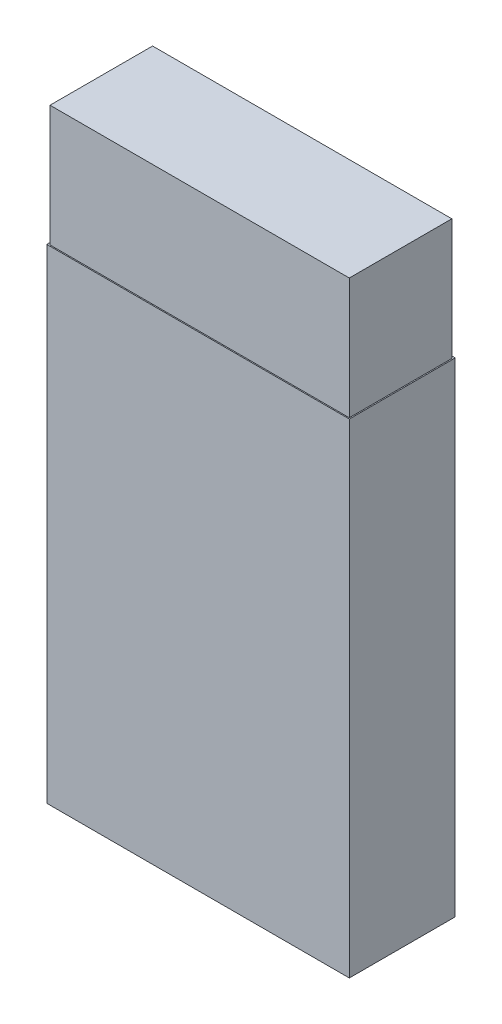
ISO-10303-21;
HEADER;
FILE_DESCRIPTION(('STEP AP214'),'2;1');
FILE_NAME('part.step','',(''),(''),'','','');
FILE_SCHEMA(('AUTOMOTIVE_DESIGN { 1 0 10303 214 1 1 1 1 }'));
ENDSEC;
DATA;
#1=APPLICATION_CONTEXT('core data for automotive mechanical design processes');
#2=APPLICATION_PROTOCOL_DEFINITION('international standard','automotive_design',2000,#1);
#3=PRODUCT_CONTEXT('',#1,'mechanical');
#4=PRODUCT('Part','Part','',(#3));
#5=PRODUCT_RELATED_PRODUCT_CATEGORY('part','',(#4));
#6=PRODUCT_DEFINITION_FORMATION('','',#4);
#7=PRODUCT_DEFINITION_CONTEXT('part definition',#1,'design');
#8=PRODUCT_DEFINITION('design','',#6,#7);
#9=PRODUCT_DEFINITION_SHAPE('','',#8);
#10=(LENGTH_UNIT() NAMED_UNIT(*) SI_UNIT(.MILLI.,.METRE.));
#11=(NAMED_UNIT(*) PLANE_ANGLE_UNIT() SI_UNIT($,.RADIAN.));
#12=(NAMED_UNIT(*) SI_UNIT($,.STERADIAN.) SOLID_ANGLE_UNIT());
#13=UNCERTAINTY_MEASURE_WITH_UNIT(LENGTH_MEASURE(1.E-05),#10,'distance_accuracy_value','');
#14=(GEOMETRIC_REPRESENTATION_CONTEXT(3) GLOBAL_UNCERTAINTY_ASSIGNED_CONTEXT((#13)) GLOBAL_UNIT_ASSIGNED_CONTEXT((#10,
#11,#12)) REPRESENTATION_CONTEXT('',''));
#15=CARTESIAN_POINT('',(0.,0.,0.));
#16=DIRECTION('',(0.,0.,1.));
#17=DIRECTION('',(1.,0.,0.));
#18=AXIS2_PLACEMENT_3D('',#15,#16,#17);
#19=CARTESIAN_POINT('',(-8.13953488372093,11.9302325581395,3.5));
#20=DIRECTION('',(0.,-1.,0.));
#21=DIRECTION('',(0.,0.,-1.));
#22=AXIS2_PLACEMENT_3D('',#19,#20,#21);
#23=PLANE('',#22);
#24=DIRECTION('',(-1.,0.,0.));
#25=VECTOR('',#24,1.);
#26=CARTESIAN_POINT('',(-8.13953488372093,11.9302325581395,0.));
#27=LINE('',#26,#25);
#28=CARTESIAN_POINT('',(1.86046511627907,11.9302325581395,0.));
#29=VERTEX_POINT('',#28);
#30=CARTESIAN_POINT('',(-8.13953488372093,11.9302325581395,0.));
#31=VERTEX_POINT('',#30);
#32=EDGE_CURVE('E135',#29,#31,#27,.T.);
#33=ORIENTED_EDGE('',*,*,#32,.T.);
#34=DIRECTION('',(0.,0.,-1.));
#35=VECTOR('',#34,1.);
#36=CARTESIAN_POINT('',(-8.13953488372093,11.9302325581395,3.5));
#37=LINE('',#36,#35);
#38=CARTESIAN_POINT('',(-8.13953488372093,11.9302325581395,3.5));
#39=VERTEX_POINT('',#38);
#40=EDGE_CURVE('E50',#39,#31,#37,.T.);
#41=ORIENTED_EDGE('',*,*,#40,.F.);
#42=DIRECTION('',(-1.,0.,0.));
#43=VECTOR('',#42,1.);
#44=CARTESIAN_POINT('',(-8.13953488372093,11.9302325581395,3.5));
#45=LINE('',#44,#43);
#46=CARTESIAN_POINT('',(1.86046511627907,11.9302325581395,3.5));
#47=VERTEX_POINT('',#46);
#48=EDGE_CURVE('E145',#47,#39,#45,.T.);
#49=ORIENTED_EDGE('',*,*,#48,.F.);
#50=DIRECTION('',(0.,0.,-1.));
#51=VECTOR('',#50,1.);
#52=CARTESIAN_POINT('',(1.86046511627907,11.9302325581395,3.5));
#53=LINE('',#52,#51);
#54=EDGE_CURVE('E11',#47,#29,#53,.T.);
#55=ORIENTED_EDGE('',*,*,#54,.T.);
#56=EDGE_LOOP('',(#33,#41,#49,#55));
#57=FACE_BOUND('',#56,.T.);
#58=DIRECTION('',(0.,0.,1.));
#59=VECTOR('',#58,1.);
#60=CARTESIAN_POINT('',(-8.06857953424163,11.9302325581395,0.0740913251380211));
#61=LINE('',#60,#59);
#62=CARTESIAN_POINT('',(-8.06857953424163,11.9302325581395,0.0740913251380211));
#63=VERTEX_POINT('',#62);
#64=CARTESIAN_POINT('',(-8.06857953424163,11.9302325581395,3.46380201324775));
#65=VERTEX_POINT('',#64);
#66=EDGE_CURVE('E57',#63,#65,#61,.T.);
#67=ORIENTED_EDGE('',*,*,#66,.F.);
#68=DIRECTION('',(-1.,0.,0.));
#69=VECTOR('',#68,1.);
#70=CARTESIAN_POINT('',(-8.06857953424163,11.9302325581395,0.0740913251380211));
#71=LINE('',#70,#69);
#72=CARTESIAN_POINT('',(1.82278620936042,11.9302325581395,0.0740913251380211));
#73=VERTEX_POINT('',#72);
#74=EDGE_CURVE('E61',#73,#63,#71,.T.);
#75=ORIENTED_EDGE('',*,*,#74,.F.);
#76=DIRECTION('',(0.,0.,-1.));
#77=VECTOR('',#76,1.);
#78=CARTESIAN_POINT('',(1.82278620936042,11.9302325581395,0.0740913251380211));
#79=LINE('',#78,#77);
#80=CARTESIAN_POINT('',(1.82278620936042,11.9302325581395,3.46380201324775));
#81=VERTEX_POINT('',#80);
#82=EDGE_CURVE('E295',#81,#73,#79,.T.);
#83=ORIENTED_EDGE('',*,*,#82,.F.);
#84=DIRECTION('',(1.,0.,0.));
#85=VECTOR('',#84,1.);
#86=CARTESIAN_POINT('',(-8.06857953424163,11.9302325581395,3.46380201324775));
#87=LINE('',#86,#85);
#88=EDGE_CURVE('E305',#65,#81,#87,.T.);
#89=ORIENTED_EDGE('',*,*,#88,.F.);
#90=EDGE_LOOP('',(#67,#75,#83,#89));
#91=FACE_BOUND('',#90,.T.);
#92=ADVANCED_FACE('F41',(#57,#91),#23,.F.);
#93=CARTESIAN_POINT('',(1.86046511627907,11.9302325581395,3.5));
#94=DIRECTION('',(-1.,0.,0.));
#95=DIRECTION('',(0.,-1.,0.));
#96=AXIS2_PLACEMENT_3D('',#93,#94,#95);
#97=PLANE('',#96);
#98=DIRECTION('',(0.,1.,0.));
#99=VECTOR('',#98,1.);
#100=CARTESIAN_POINT('',(1.86046511627907,11.9302325581395,0.));
#101=LINE('',#100,#99);
#102=CARTESIAN_POINT('',(1.86046511627907,-4.06976744186047,0.));
#103=VERTEX_POINT('',#102);
#104=EDGE_CURVE('E130',#103,#29,#101,.T.);
#105=ORIENTED_EDGE('',*,*,#104,.T.);
#106=ORIENTED_EDGE('',*,*,#54,.F.);
#107=DIRECTION('',(0.,1.,0.));
#108=VECTOR('',#107,1.);
#109=CARTESIAN_POINT('',(1.86046511627907,11.9302325581395,3.5));
#110=LINE('',#109,#108);
#111=CARTESIAN_POINT('',(1.86046511627907,-4.06976744186047,3.5));
#112=VERTEX_POINT('',#111);
#113=EDGE_CURVE('E141',#112,#47,#110,.T.);
#114=ORIENTED_EDGE('',*,*,#113,.F.);
#115=DIRECTION('',(0.,0.,-1.));
#116=VECTOR('',#115,1.);
#117=CARTESIAN_POINT('',(1.86046511627907,-4.06976744186047,3.5));
#118=LINE('',#117,#116);
#119=EDGE_CURVE('E154',#112,#103,#118,.T.);
#120=ORIENTED_EDGE('',*,*,#119,.T.);
#121=EDGE_LOOP('',(#105,#106,#114,#120));
#122=FACE_BOUND('',#121,.T.);
#123=ADVANCED_FACE('F43',(#122),#97,.F.);
#124=CARTESIAN_POINT('',(-8.13953488372093,11.9302325581395,3.5));
#125=DIRECTION('',(1.,0.,0.));
#126=DIRECTION('',(0.,1.,0.));
#127=AXIS2_PLACEMENT_3D('',#124,#125,#126);
#128=PLANE('',#127);
#129=DIRECTION('',(0.,-1.,0.));
#130=VECTOR('',#129,1.);
#131=CARTESIAN_POINT('',(-8.13953488372093,11.9302325581395,0.));
#132=LINE('',#131,#130);
#133=CARTESIAN_POINT('',(-8.13953488372093,-4.06976744186047,0.));
#134=VERTEX_POINT('',#133);
#135=EDGE_CURVE('E158',#31,#134,#132,.T.);
#136=ORIENTED_EDGE('',*,*,#135,.T.);
#137=DIRECTION('',(0.,0.,-1.));
#138=VECTOR('',#137,1.);
#139=CARTESIAN_POINT('',(-8.13953488372093,-4.06976744186047,3.5));
#140=LINE('',#139,#138);
#141=CARTESIAN_POINT('',(-8.13953488372093,-4.06976744186047,3.5));
#142=VERTEX_POINT('',#141);
#143=EDGE_CURVE('E166',#142,#134,#140,.T.);
#144=ORIENTED_EDGE('',*,*,#143,.F.);
#145=DIRECTION('',(0.,-1.,0.));
#146=VECTOR('',#145,1.);
#147=CARTESIAN_POINT('',(-8.13953488372093,11.9302325581395,3.5));
#148=LINE('',#147,#146);
#149=EDGE_CURVE('E149',#39,#142,#148,.T.);
#150=ORIENTED_EDGE('',*,*,#149,.F.);
#151=ORIENTED_EDGE('',*,*,#40,.T.);
#152=EDGE_LOOP('',(#136,#144,#150,#151));
#153=FACE_BOUND('',#152,.T.);
#154=ADVANCED_FACE('F175',(#153),#128,.F.);
#155=CARTESIAN_POINT('',(-8.13953488372093,-4.06976744186047,3.5));
#156=DIRECTION('',(0.,1.,0.));
#157=DIRECTION('',(0.,0.,1.));
#158=AXIS2_PLACEMENT_3D('',#155,#156,#157);
#159=PLANE('',#158);
#160=DIRECTION('',(1.,0.,0.));
#161=VECTOR('',#160,1.);
#162=CARTESIAN_POINT('',(-8.13953488372093,-4.06976744186047,0.));
#163=LINE('',#162,#161);
#164=EDGE_CURVE('E146',#134,#103,#163,.T.);
#165=ORIENTED_EDGE('',*,*,#164,.T.);
#166=ORIENTED_EDGE('',*,*,#119,.F.);
#167=DIRECTION('',(1.,0.,0.));
#168=VECTOR('',#167,1.);
#169=CARTESIAN_POINT('',(-8.13953488372093,-4.06976744186047,3.5));
#170=LINE('',#169,#168);
#171=EDGE_CURVE('E152',#142,#112,#170,.T.);
#172=ORIENTED_EDGE('',*,*,#171,.F.);
#173=ORIENTED_EDGE('',*,*,#143,.T.);
#174=EDGE_LOOP('',(#165,#166,#172,#173));
#175=FACE_BOUND('',#174,.T.);
#176=ADVANCED_FACE('F184',(#175),#159,.F.);
#177=CARTESIAN_POINT('',(0.,0.,3.5));
#178=DIRECTION('',(0.,0.,1.));
#179=DIRECTION('',(1.,0.,0.));
#180=AXIS2_PLACEMENT_3D('',#177,#178,#179);
#181=PLANE('',#180);
#182=ORIENTED_EDGE('',*,*,#113,.T.);
#183=ORIENTED_EDGE('',*,*,#48,.T.);
#184=ORIENTED_EDGE('',*,*,#149,.T.);
#185=ORIENTED_EDGE('',*,*,#171,.T.);
#186=EDGE_LOOP('',(#182,#183,#184,#185));
#187=FACE_BOUND('',#186,.T.);
#188=ADVANCED_FACE('F190',(#187),#181,.T.);
#189=CARTESIAN_POINT('',(0.,0.,0.));
#190=DIRECTION('',(0.,0.,1.));
#191=DIRECTION('',(1.,0.,0.));
#192=AXIS2_PLACEMENT_3D('',#189,#190,#191);
#193=PLANE('',#192);
#194=ORIENTED_EDGE('',*,*,#104,.F.);
#195=ORIENTED_EDGE('',*,*,#164,.F.);
#196=ORIENTED_EDGE('',*,*,#135,.F.);
#197=ORIENTED_EDGE('',*,*,#32,.F.);
#198=EDGE_LOOP('',(#194,#195,#196,#197));
#199=FACE_BOUND('',#198,.T.);
#200=ADVANCED_FACE('F181',(#199),#193,.F.);
#201=CARTESIAN_POINT('',(-8.06857953424163,15.9302325581395,0.0740913251380211));
#202=DIRECTION('',(1.,0.,0.));
#203=DIRECTION('',(0.,0.,-1.));
#204=AXIS2_PLACEMENT_3D('',#201,#202,#203);
#205=PLANE('',#204);
#206=ORIENTED_EDGE('',*,*,#66,.T.);
#207=DIRECTION('',(0.,-1.,0.));
#208=VECTOR('',#207,1.);
#209=CARTESIAN_POINT('',(-8.06857953424163,15.9302325581395,3.46380201324775));
#210=LINE('',#209,#208);
#211=CARTESIAN_POINT('',(-8.06857953424163,15.9302325581395,3.46380201324775));
#212=VERTEX_POINT('',#211);
#213=EDGE_CURVE('E110',#212,#65,#210,.T.);
#214=ORIENTED_EDGE('',*,*,#213,.F.);
#215=DIRECTION('',(0.,0.,1.));
#216=VECTOR('',#215,1.);
#217=CARTESIAN_POINT('',(-8.06857953424163,15.9302325581395,0.0740913251380211));
#218=LINE('',#217,#216);
#219=CARTESIAN_POINT('',(-8.06857953424163,15.9302325581395,0.0740913251380211));
#220=VERTEX_POINT('',#219);
#221=EDGE_CURVE('E117',#220,#212,#218,.T.);
#222=ORIENTED_EDGE('',*,*,#221,.F.);
#223=DIRECTION('',(0.,-1.,0.));
#224=VECTOR('',#223,1.);
#225=CARTESIAN_POINT('',(-8.06857953424163,15.9302325581395,0.0740913251380211));
#226=LINE('',#225,#224);
#227=EDGE_CURVE('E292',#220,#63,#226,.T.);
#228=ORIENTED_EDGE('',*,*,#227,.T.);
#229=EDGE_LOOP('',(#206,#214,#222,#228));
#230=FACE_BOUND('',#229,.T.);
#231=ADVANCED_FACE('F128',(#230),#205,.F.);
#232=CARTESIAN_POINT('',(-8.06857953424163,15.9302325581395,3.46380201324775));
#233=DIRECTION('',(0.,0.,-1.));
#234=DIRECTION('',(-1.,0.,0.));
#235=AXIS2_PLACEMENT_3D('',#232,#233,#234);
#236=PLANE('',#235);
#237=ORIENTED_EDGE('',*,*,#88,.T.);
#238=DIRECTION('',(0.,-1.,0.));
#239=VECTOR('',#238,1.);
#240=CARTESIAN_POINT('',(1.82278620936042,15.9302325581395,3.46380201324775));
#241=LINE('',#240,#239);
#242=CARTESIAN_POINT('',(1.82278620936042,15.9302325581395,3.46380201324775));
#243=VERTEX_POINT('',#242);
#244=EDGE_CURVE('E112',#243,#81,#241,.T.);
#245=ORIENTED_EDGE('',*,*,#244,.F.);
#246=DIRECTION('',(1.,0.,0.));
#247=VECTOR('',#246,1.);
#248=CARTESIAN_POINT('',(-8.06857953424163,15.9302325581395,3.46380201324775));
#249=LINE('',#248,#247);
#250=EDGE_CURVE('E105',#212,#243,#249,.T.);
#251=ORIENTED_EDGE('',*,*,#250,.F.);
#252=ORIENTED_EDGE('',*,*,#213,.T.);
#253=EDGE_LOOP('',(#237,#245,#251,#252));
#254=FACE_BOUND('',#253,.T.);
#255=ADVANCED_FACE('F108',(#254),#236,.F.);
#256=CARTESIAN_POINT('',(1.82278620936042,15.9302325581395,0.0740913251380211));
#257=DIRECTION('',(-1.,0.,0.));
#258=DIRECTION('',(0.,0.,1.));
#259=AXIS2_PLACEMENT_3D('',#256,#257,#258);
#260=PLANE('',#259);
#261=ORIENTED_EDGE('',*,*,#82,.T.);
#262=DIRECTION('',(0.,-1.,0.));
#263=VECTOR('',#262,1.);
#264=CARTESIAN_POINT('',(1.82278620936042,15.9302325581395,0.0740913251380211));
#265=LINE('',#264,#263);
#266=CARTESIAN_POINT('',(1.82278620936042,15.9302325581395,0.0740913251380211));
#267=VERTEX_POINT('',#266);
#268=EDGE_CURVE('E137',#267,#73,#265,.T.);
#269=ORIENTED_EDGE('',*,*,#268,.F.);
#270=DIRECTION('',(0.,0.,-1.));
#271=VECTOR('',#270,1.);
#272=CARTESIAN_POINT('',(1.82278620936042,15.9302325581395,0.0740913251380211));
#273=LINE('',#272,#271);
#274=EDGE_CURVE('E116',#243,#267,#273,.T.);
#275=ORIENTED_EDGE('',*,*,#274,.F.);
#276=ORIENTED_EDGE('',*,*,#244,.T.);
#277=EDGE_LOOP('',(#261,#269,#275,#276));
#278=FACE_BOUND('',#277,.T.);
#279=ADVANCED_FACE('F208',(#278),#260,.F.);
#280=CARTESIAN_POINT('',(-8.06857953424163,15.9302325581395,0.0740913251380211));
#281=DIRECTION('',(0.,0.,1.));
#282=DIRECTION('',(1.,0.,0.));
#283=AXIS2_PLACEMENT_3D('',#280,#281,#282);
#284=PLANE('',#283);
#285=ORIENTED_EDGE('',*,*,#74,.T.);
#286=ORIENTED_EDGE('',*,*,#227,.F.);
#287=DIRECTION('',(-1.,0.,0.));
#288=VECTOR('',#287,1.);
#289=CARTESIAN_POINT('',(-8.06857953424163,15.9302325581395,0.0740913251380211));
#290=LINE('',#289,#288);
#291=EDGE_CURVE('E122',#267,#220,#290,.T.);
#292=ORIENTED_EDGE('',*,*,#291,.F.);
#293=ORIENTED_EDGE('',*,*,#268,.T.);
#294=EDGE_LOOP('',(#285,#286,#292,#293));
#295=FACE_BOUND('',#294,.T.);
#296=ADVANCED_FACE('F211',(#295),#284,.F.);
#297=CARTESIAN_POINT('',(0.,15.9302325581395,0.));
#298=DIRECTION('',(0.,1.,0.));
#299=DIRECTION('',(0.,0.,1.));
#300=AXIS2_PLACEMENT_3D('',#297,#298,#299);
#301=PLANE('',#300);
#302=ORIENTED_EDGE('',*,*,#221,.T.);
#303=ORIENTED_EDGE('',*,*,#250,.T.);
#304=ORIENTED_EDGE('',*,*,#274,.T.);
#305=ORIENTED_EDGE('',*,*,#291,.T.);
#306=EDGE_LOOP('',(#302,#303,#304,#305));
#307=FACE_BOUND('',#306,.T.);
#308=ADVANCED_FACE('F120',(#307),#301,.T.);
#309=CLOSED_SHELL('',(#92,#123,#154,#176,#188,#200,#231,#255,#279,#296,#308));
#310=MANIFOLD_SOLID_BREP('B2',#309);
#311=ADVANCED_BREP_SHAPE_REPRESENTATION('',(#18,#310),#14);
#312=SHAPE_DEFINITION_REPRESENTATION(#9,#311);
ENDSEC;
END-ISO-10303-21;
